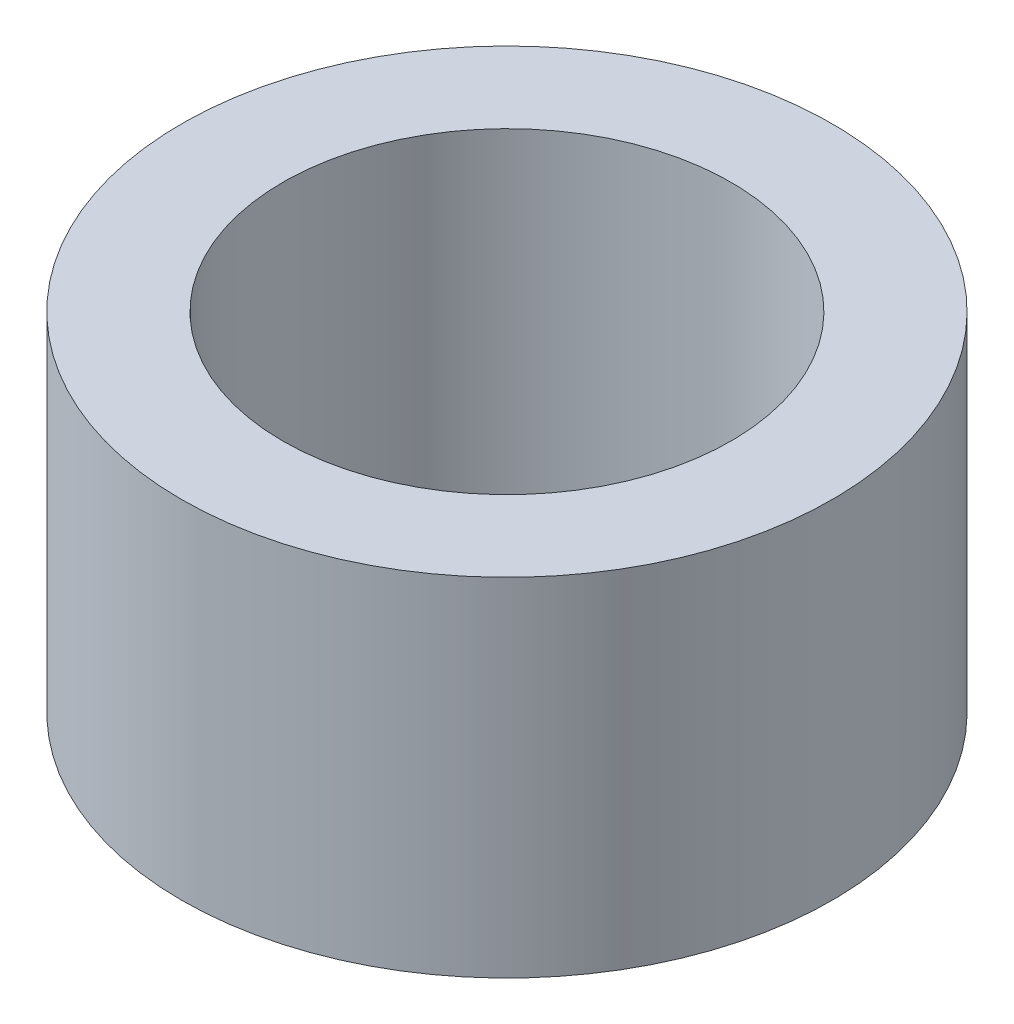
ISO-10303-21;
HEADER;
FILE_DESCRIPTION(('STEP AP214'),'2;1');
FILE_NAME('part.step','',(''),(''),'','','');
FILE_SCHEMA(('AUTOMOTIVE_DESIGN { 1 0 10303 214 1 1 1 1 }'));
ENDSEC;
DATA;
#1=APPLICATION_CONTEXT('core data for automotive mechanical design processes');
#2=APPLICATION_PROTOCOL_DEFINITION('international standard','automotive_design',2000,#1);
#3=PRODUCT_CONTEXT('',#1,'mechanical');
#4=PRODUCT('Part','Part','',(#3));
#5=PRODUCT_RELATED_PRODUCT_CATEGORY('part','',(#4));
#6=PRODUCT_DEFINITION_FORMATION('','',#4);
#7=PRODUCT_DEFINITION_CONTEXT('part definition',#1,'design');
#8=PRODUCT_DEFINITION('design','',#6,#7);
#9=PRODUCT_DEFINITION_SHAPE('','',#8);
#10=(LENGTH_UNIT() NAMED_UNIT(*) SI_UNIT(.MILLI.,.METRE.));
#11=(NAMED_UNIT(*) PLANE_ANGLE_UNIT() SI_UNIT($,.RADIAN.));
#12=(NAMED_UNIT(*) SI_UNIT($,.STERADIAN.) SOLID_ANGLE_UNIT());
#13=UNCERTAINTY_MEASURE_WITH_UNIT(LENGTH_MEASURE(1.E-05),#10,'distance_accuracy_value','');
#14=(GEOMETRIC_REPRESENTATION_CONTEXT(3) GLOBAL_UNCERTAINTY_ASSIGNED_CONTEXT((#13)) GLOBAL_UNIT_ASSIGNED_CONTEXT((#10,
#11,#12)) REPRESENTATION_CONTEXT('',''));
#15=CARTESIAN_POINT('',(0.,0.,0.));
#16=DIRECTION('',(0.,0.,1.));
#17=DIRECTION('',(1.,0.,0.));
#18=AXIS2_PLACEMENT_3D('',#15,#16,#17);
#19=CARTESIAN_POINT('',(0.,4.8,0.));
#20=DIRECTION('',(0.,1.,0.));
#21=DIRECTION('',(0.,0.,1.));
#22=AXIS2_PLACEMENT_3D('',#19,#20,#21);
#23=PLANE('',#22);
#24=CARTESIAN_POINT('',(0.,4.8,0.));
#25=DIRECTION('',(0.,1.,0.));
#26=DIRECTION('',(0.,0.,1.));
#27=AXIS2_PLACEMENT_3D('',#24,#25,#26);
#28=CIRCLE('',#27,4.5);
#29=CARTESIAN_POINT('',(0.,4.8,4.5));
#30=VERTEX_POINT('',#29);
#31=EDGE_CURVE('E11',#30,#30,#28,.T.);
#32=ORIENTED_EDGE('',*,*,#31,.T.);
#33=EDGE_LOOP('',(#32));
#34=FACE_BOUND('',#33,.T.);
#35=CARTESIAN_POINT('',(0.,4.8,0.));
#36=DIRECTION('',(0.,1.,0.));
#37=DIRECTION('',(0.,0.,1.));
#38=AXIS2_PLACEMENT_3D('',#35,#36,#37);
#39=CIRCLE('',#38,3.1);
#40=CARTESIAN_POINT('',(0.,4.8,3.1));
#41=VERTEX_POINT('',#40);
#42=EDGE_CURVE('E58',#41,#41,#39,.T.);
#43=ORIENTED_EDGE('',*,*,#42,.F.);
#44=EDGE_LOOP('',(#43));
#45=FACE_BOUND('',#44,.T.);
#46=ADVANCED_FACE('F43',(#34,#45),#23,.T.);
#47=CARTESIAN_POINT('',(0.,0.,0.));
#48=DIRECTION('',(0.,1.,0.));
#49=DIRECTION('',(0.,0.,1.));
#50=AXIS2_PLACEMENT_3D('',#47,#48,#49);
#51=PLANE('',#50);
#52=CARTESIAN_POINT('',(0.,0.,0.));
#53=DIRECTION('',(0.,1.,0.));
#54=DIRECTION('',(0.,0.,1.));
#55=AXIS2_PLACEMENT_3D('',#52,#53,#54);
#56=CIRCLE('',#55,4.5);
#57=CARTESIAN_POINT('',(0.,0.,4.5));
#58=VERTEX_POINT('',#57);
#59=EDGE_CURVE('E52',#58,#58,#56,.T.);
#60=ORIENTED_EDGE('',*,*,#59,.F.);
#61=EDGE_LOOP('',(#60));
#62=FACE_BOUND('',#61,.T.);
#63=CARTESIAN_POINT('',(0.,0.,0.));
#64=DIRECTION('',(0.,1.,0.));
#65=DIRECTION('',(0.,0.,1.));
#66=AXIS2_PLACEMENT_3D('',#63,#64,#65);
#67=CIRCLE('',#66,3.1);
#68=CARTESIAN_POINT('',(0.,0.,3.1));
#69=VERTEX_POINT('',#68);
#70=EDGE_CURVE('E47',#69,#69,#67,.T.);
#71=ORIENTED_EDGE('',*,*,#70,.T.);
#72=EDGE_LOOP('',(#71));
#73=FACE_BOUND('',#72,.T.);
#74=ADVANCED_FACE('F68',(#62,#73),#51,.F.);
#75=CARTESIAN_POINT('',(0.,4.8,0.));
#76=DIRECTION('',(0.,-1.,0.));
#77=DIRECTION('',(0.,0.,-1.));
#78=AXIS2_PLACEMENT_3D('',#75,#76,#77);
#79=CYLINDRICAL_SURFACE('',#78,4.5);
#80=ORIENTED_EDGE('',*,*,#31,.F.);
#81=EDGE_LOOP('',(#80));
#82=FACE_BOUND('',#81,.T.);
#83=ORIENTED_EDGE('',*,*,#59,.T.);
#84=EDGE_LOOP('',(#83));
#85=FACE_BOUND('',#84,.T.);
#86=ADVANCED_FACE('F71',(#82,#85),#79,.T.);
#87=CARTESIAN_POINT('',(0.,4.8,0.));
#88=DIRECTION('',(0.,-1.,0.));
#89=DIRECTION('',(0.,0.,-1.));
#90=AXIS2_PLACEMENT_3D('',#87,#88,#89);
#91=CYLINDRICAL_SURFACE('',#90,3.1);
#92=ORIENTED_EDGE('',*,*,#42,.T.);
#93=EDGE_LOOP('',(#92));
#94=FACE_BOUND('',#93,.T.);
#95=ORIENTED_EDGE('',*,*,#70,.F.);
#96=EDGE_LOOP('',(#95));
#97=FACE_BOUND('',#96,.T.);
#98=ADVANCED_FACE('F45',(#94,#97),#91,.F.);
#99=CLOSED_SHELL('',(#46,#74,#86,#98));
#100=MANIFOLD_SOLID_BREP('B2',#99);
#101=ADVANCED_BREP_SHAPE_REPRESENTATION('',(#18,#100),#14);
#102=SHAPE_DEFINITION_REPRESENTATION(#9,#101);
ENDSEC;
END-ISO-10303-21;
